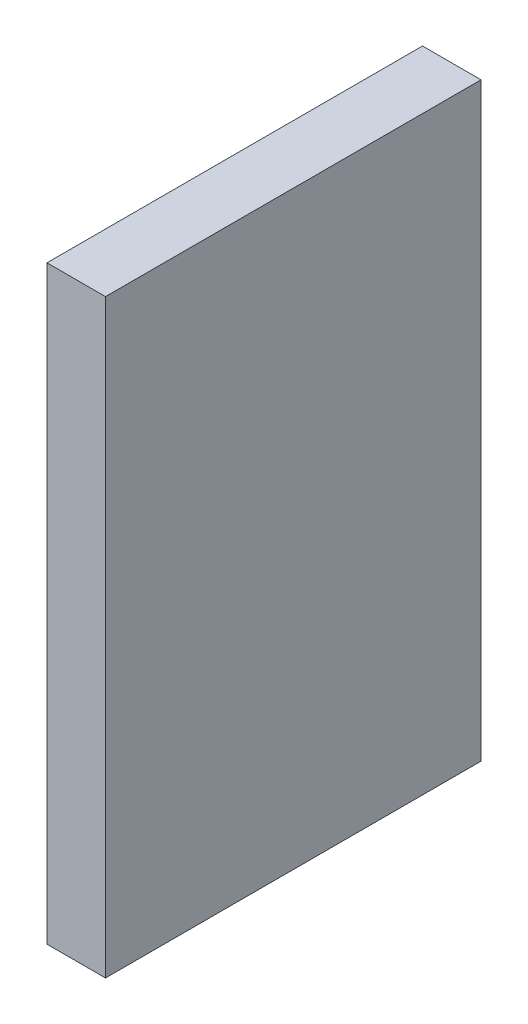
ISO-10303-21;
HEADER;
FILE_DESCRIPTION(('STEP AP214'),'2;1');
FILE_NAME('part.step','',(''),(''),'','','');
FILE_SCHEMA(('AUTOMOTIVE_DESIGN { 1 0 10303 214 1 1 1 1 }'));
ENDSEC;
DATA;
#1=APPLICATION_CONTEXT('core data for automotive mechanical design processes');
#2=APPLICATION_PROTOCOL_DEFINITION('international standard','automotive_design',2000,#1);
#3=PRODUCT_CONTEXT('',#1,'mechanical');
#4=PRODUCT('Part','Part','',(#3));
#5=PRODUCT_RELATED_PRODUCT_CATEGORY('part','',(#4));
#6=PRODUCT_DEFINITION_FORMATION('','',#4);
#7=PRODUCT_DEFINITION_CONTEXT('part definition',#1,'design');
#8=PRODUCT_DEFINITION('design','',#6,#7);
#9=PRODUCT_DEFINITION_SHAPE('','',#8);
#10=(LENGTH_UNIT() NAMED_UNIT(*) SI_UNIT(.MILLI.,.METRE.));
#11=(NAMED_UNIT(*) PLANE_ANGLE_UNIT() SI_UNIT($,.RADIAN.));
#12=(NAMED_UNIT(*) SI_UNIT($,.STERADIAN.) SOLID_ANGLE_UNIT());
#13=UNCERTAINTY_MEASURE_WITH_UNIT(LENGTH_MEASURE(1.E-05),#10,'distance_accuracy_value','');
#14=(GEOMETRIC_REPRESENTATION_CONTEXT(3) GLOBAL_UNCERTAINTY_ASSIGNED_CONTEXT((#13)) GLOBAL_UNIT_ASSIGNED_CONTEXT((#10,
#11,#12)) REPRESENTATION_CONTEXT('',''));
#15=CARTESIAN_POINT('',(0.,0.,0.));
#16=DIRECTION('',(0.,0.,1.));
#17=DIRECTION('',(1.,0.,0.));
#18=AXIS2_PLACEMENT_3D('',#15,#16,#17);
#19=CARTESIAN_POINT('',(0.,0.,77.));
#20=DIRECTION('',(0.,0.,1.));
#21=DIRECTION('',(1.,0.,0.));
#22=AXIS2_PLACEMENT_3D('',#19,#20,#21);
#23=PLANE('',#22);
#24=DIRECTION('',(0.,1.,0.));
#25=VECTOR('',#24,1.);
#26=CARTESIAN_POINT('',(0.,0.,77.));
#27=LINE('',#26,#25);
#28=CARTESIAN_POINT('',(0.,0.,77.));
#29=VERTEX_POINT('',#28);
#30=CARTESIAN_POINT('',(0.,121.,77.));
#31=VERTEX_POINT('',#30);
#32=EDGE_CURVE('E67',#29,#31,#27,.T.);
#33=ORIENTED_EDGE('',*,*,#32,.F.);
#34=DIRECTION('',(1.,0.,0.));
#35=VECTOR('',#34,1.);
#36=CARTESIAN_POINT('',(0.,0.,77.));
#37=LINE('',#36,#35);
#38=CARTESIAN_POINT('',(12.,0.,77.));
#39=VERTEX_POINT('',#38);
#40=EDGE_CURVE('E19',#29,#39,#37,.T.);
#41=ORIENTED_EDGE('',*,*,#40,.T.);
#42=DIRECTION('',(0.,1.,0.));
#43=VECTOR('',#42,1.);
#44=CARTESIAN_POINT('',(12.,0.,77.));
#45=LINE('',#44,#43);
#46=CARTESIAN_POINT('',(12.,121.,77.));
#47=VERTEX_POINT('',#46);
#48=EDGE_CURVE('E64',#39,#47,#45,.T.);
#49=ORIENTED_EDGE('',*,*,#48,.T.);
#50=DIRECTION('',(1.,0.,0.));
#51=VECTOR('',#50,1.);
#52=CARTESIAN_POINT('',(0.,121.,77.));
#53=LINE('',#52,#51);
#54=EDGE_CURVE('E10',#31,#47,#53,.T.);
#55=ORIENTED_EDGE('',*,*,#54,.F.);
#56=EDGE_LOOP('',(#33,#41,#49,#55));
#57=FACE_BOUND('',#56,.T.);
#58=ADVANCED_FACE('F15',(#57),#23,.T.);
#59=CARTESIAN_POINT('',(0.,0.,0.));
#60=DIRECTION('',(0.,0.,1.));
#61=DIRECTION('',(1.,0.,0.));
#62=AXIS2_PLACEMENT_3D('',#59,#60,#61);
#63=PLANE('',#62);
#64=DIRECTION('',(1.,0.,0.));
#65=VECTOR('',#64,1.);
#66=CARTESIAN_POINT('',(0.,121.,0.));
#67=LINE('',#66,#65);
#68=CARTESIAN_POINT('',(0.,121.,0.));
#69=VERTEX_POINT('',#68);
#70=CARTESIAN_POINT('',(12.,121.,0.));
#71=VERTEX_POINT('',#70);
#72=EDGE_CURVE('E26',#69,#71,#67,.T.);
#73=ORIENTED_EDGE('',*,*,#72,.T.);
#74=DIRECTION('',(0.,1.,0.));
#75=VECTOR('',#74,1.);
#76=CARTESIAN_POINT('',(12.,0.,0.));
#77=LINE('',#76,#75);
#78=CARTESIAN_POINT('',(12.,0.,0.));
#79=VERTEX_POINT('',#78);
#80=EDGE_CURVE('E85',#79,#71,#77,.T.);
#81=ORIENTED_EDGE('',*,*,#80,.F.);
#82=DIRECTION('',(1.,0.,0.));
#83=VECTOR('',#82,1.);
#84=CARTESIAN_POINT('',(0.,0.,0.));
#85=LINE('',#84,#83);
#86=CARTESIAN_POINT('',(0.,0.,0.));
#87=VERTEX_POINT('',#86);
#88=EDGE_CURVE('E73',#87,#79,#85,.T.);
#89=ORIENTED_EDGE('',*,*,#88,.F.);
#90=DIRECTION('',(0.,1.,0.));
#91=VECTOR('',#90,1.);
#92=CARTESIAN_POINT('',(0.,0.,0.));
#93=LINE('',#92,#91);
#94=EDGE_CURVE('E94',#87,#69,#93,.T.);
#95=ORIENTED_EDGE('',*,*,#94,.T.);
#96=EDGE_LOOP('',(#73,#81,#89,#95));
#97=FACE_BOUND('',#96,.T.);
#98=ADVANCED_FACE('F118',(#97),#63,.F.);
#99=CARTESIAN_POINT('',(0.,121.,0.));
#100=DIRECTION('',(0.,1.,0.));
#101=DIRECTION('',(1.,0.,0.));
#102=AXIS2_PLACEMENT_3D('',#99,#100,#101);
#103=PLANE('',#102);
#104=ORIENTED_EDGE('',*,*,#72,.F.);
#105=DIRECTION('',(0.,0.,1.));
#106=VECTOR('',#105,1.);
#107=CARTESIAN_POINT('',(0.,121.,0.));
#108=LINE('',#107,#106);
#109=EDGE_CURVE('E105',#69,#31,#108,.T.);
#110=ORIENTED_EDGE('',*,*,#109,.T.);
#111=ORIENTED_EDGE('',*,*,#54,.T.);
#112=DIRECTION('',(0.,0.,1.));
#113=VECTOR('',#112,1.);
#114=CARTESIAN_POINT('',(12.,121.,0.));
#115=LINE('',#114,#113);
#116=EDGE_CURVE('E79',#71,#47,#115,.T.);
#117=ORIENTED_EDGE('',*,*,#116,.F.);
#118=EDGE_LOOP('',(#104,#110,#111,#117));
#119=FACE_BOUND('',#118,.T.);
#120=ADVANCED_FACE('F123',(#119),#103,.T.);
#121=CARTESIAN_POINT('',(0.,0.,0.));
#122=DIRECTION('',(0.,1.,0.));
#123=DIRECTION('',(1.,0.,0.));
#124=AXIS2_PLACEMENT_3D('',#121,#122,#123);
#125=PLANE('',#124);
#126=DIRECTION('',(0.,0.,1.));
#127=VECTOR('',#126,1.);
#128=CARTESIAN_POINT('',(12.,0.,0.));
#129=LINE('',#128,#127);
#130=EDGE_CURVE('E78',#79,#39,#129,.T.);
#131=ORIENTED_EDGE('',*,*,#130,.T.);
#132=ORIENTED_EDGE('',*,*,#40,.F.);
#133=DIRECTION('',(0.,0.,1.));
#134=VECTOR('',#133,1.);
#135=CARTESIAN_POINT('',(0.,0.,0.));
#136=LINE('',#135,#134);
#137=EDGE_CURVE('E86',#87,#29,#136,.T.);
#138=ORIENTED_EDGE('',*,*,#137,.F.);
#139=ORIENTED_EDGE('',*,*,#88,.T.);
#140=EDGE_LOOP('',(#131,#132,#138,#139));
#141=FACE_BOUND('',#140,.T.);
#142=ADVANCED_FACE('F17',(#141),#125,.F.);
#143=CARTESIAN_POINT('',(12.,0.,0.));
#144=DIRECTION('',(1.,0.,0.));
#145=DIRECTION('',(0.,1.,0.));
#146=AXIS2_PLACEMENT_3D('',#143,#144,#145);
#147=PLANE('',#146);
#148=ORIENTED_EDGE('',*,*,#130,.F.);
#149=ORIENTED_EDGE('',*,*,#80,.T.);
#150=ORIENTED_EDGE('',*,*,#116,.T.);
#151=ORIENTED_EDGE('',*,*,#48,.F.);
#152=EDGE_LOOP('',(#148,#149,#150,#151));
#153=FACE_BOUND('',#152,.T.);
#154=ADVANCED_FACE('F76',(#153),#147,.T.);
#155=CARTESIAN_POINT('',(0.,0.,0.));
#156=DIRECTION('',(1.,0.,0.));
#157=DIRECTION('',(0.,1.,0.));
#158=AXIS2_PLACEMENT_3D('',#155,#156,#157);
#159=PLANE('',#158);
#160=ORIENTED_EDGE('',*,*,#32,.T.);
#161=ORIENTED_EDGE('',*,*,#109,.F.);
#162=ORIENTED_EDGE('',*,*,#94,.F.);
#163=ORIENTED_EDGE('',*,*,#137,.T.);
#164=EDGE_LOOP('',(#160,#161,#162,#163));
#165=FACE_BOUND('',#164,.T.);
#166=ADVANCED_FACE('F113',(#165),#159,.F.);
#167=CLOSED_SHELL('',(#58,#98,#120,#142,#154,#166));
#168=MANIFOLD_SOLID_BREP('B1',#167);
#169=ADVANCED_BREP_SHAPE_REPRESENTATION('',(#18,#168),#14);
#170=SHAPE_DEFINITION_REPRESENTATION(#9,#169);
ENDSEC;
END-ISO-10303-21;
